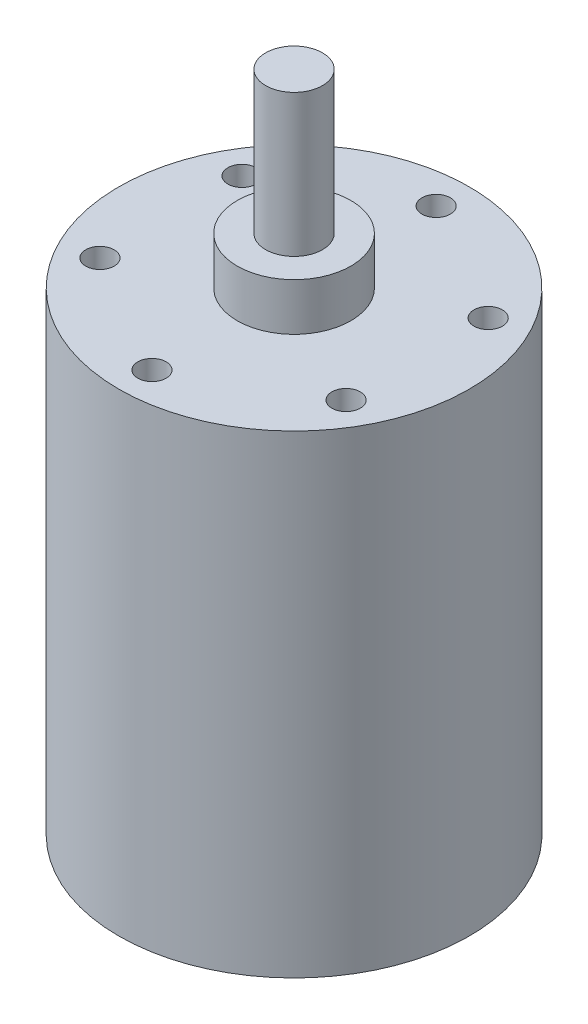
ISO-10303-21;
HEADER;
FILE_DESCRIPTION(('STEP AP214'),'2;1');
FILE_NAME('part.step','',(''),(''),'','','');
FILE_SCHEMA(('AUTOMOTIVE_DESIGN { 1 0 10303 214 1 1 1 1 }'));
ENDSEC;
DATA;
#1=APPLICATION_CONTEXT('core data for automotive mechanical design processes');
#2=APPLICATION_PROTOCOL_DEFINITION('international standard','automotive_design',2000,#1);
#3=PRODUCT_CONTEXT('',#1,'mechanical');
#4=PRODUCT('Part','Part','',(#3));
#5=PRODUCT_RELATED_PRODUCT_CATEGORY('part','',(#4));
#6=PRODUCT_DEFINITION_FORMATION('','',#4);
#7=PRODUCT_DEFINITION_CONTEXT('part definition',#1,'design');
#8=PRODUCT_DEFINITION('design','',#6,#7);
#9=PRODUCT_DEFINITION_SHAPE('','',#8);
#10=(LENGTH_UNIT() NAMED_UNIT(*) SI_UNIT(.MILLI.,.METRE.));
#11=(NAMED_UNIT(*) PLANE_ANGLE_UNIT() SI_UNIT($,.RADIAN.));
#12=(NAMED_UNIT(*) SI_UNIT($,.STERADIAN.) SOLID_ANGLE_UNIT());
#13=UNCERTAINTY_MEASURE_WITH_UNIT(LENGTH_MEASURE(1.E-05),#10,'distance_accuracy_value','');
#14=(GEOMETRIC_REPRESENTATION_CONTEXT(3) GLOBAL_UNCERTAINTY_ASSIGNED_CONTEXT((#13)) GLOBAL_UNIT_ASSIGNED_CONTEXT((#10,
#11,#12)) REPRESENTATION_CONTEXT('',''));
#15=CARTESIAN_POINT('',(0.,0.,0.));
#16=DIRECTION('',(0.,0.,1.));
#17=DIRECTION('',(1.,0.,0.));
#18=AXIS2_PLACEMENT_3D('',#15,#16,#17);
#19=CARTESIAN_POINT('',(0.,50.,0.));
#20=DIRECTION('',(0.,-1.,0.));
#21=DIRECTION('',(0.,0.,-1.));
#22=AXIS2_PLACEMENT_3D('',#19,#20,#21);
#23=CYLINDRICAL_SURFACE('',#22,18.5);
#24=CARTESIAN_POINT('',(0.,50.,0.));
#25=DIRECTION('',(0.,1.,0.));
#26=DIRECTION('',(0.,0.,1.));
#27=AXIS2_PLACEMENT_3D('',#24,#25,#26);
#28=CIRCLE('',#27,18.5);
#29=CARTESIAN_POINT('',(0.,50.,18.5));
#30=VERTEX_POINT('',#29);
#31=EDGE_CURVE('E42',#30,#30,#28,.T.);
#32=ORIENTED_EDGE('',*,*,#31,.F.);
#33=EDGE_LOOP('',(#32));
#34=FACE_BOUND('',#33,.T.);
#35=CARTESIAN_POINT('',(0.,0.,0.));
#36=DIRECTION('',(0.,1.,0.));
#37=DIRECTION('',(0.,0.,1.));
#38=AXIS2_PLACEMENT_3D('',#35,#36,#37);
#39=CIRCLE('',#38,18.5);
#40=CARTESIAN_POINT('',(0.,0.,18.5));
#41=VERTEX_POINT('',#40);
#42=EDGE_CURVE('E33',#41,#41,#39,.T.);
#43=ORIENTED_EDGE('',*,*,#42,.T.);
#44=EDGE_LOOP('',(#43));
#45=FACE_BOUND('',#44,.T.);
#46=ADVANCED_FACE('F30',(#34,#45),#23,.T.);
#47=CARTESIAN_POINT('',(0.,50.,0.));
#48=DIRECTION('',(0.,1.,0.));
#49=DIRECTION('',(0.,0.,1.));
#50=AXIS2_PLACEMENT_3D('',#47,#48,#49);
#51=PLANE('',#50);
#52=CARTESIAN_POINT('',(0.,50.,-15.));
#53=DIRECTION('',(0.,1.,0.));
#54=DIRECTION('',(0.,0.,1.));
#55=AXIS2_PLACEMENT_3D('',#52,#53,#54);
#56=CIRCLE('',#55,1.5);
#57=CARTESIAN_POINT('',(0.,50.,-13.5));
#58=VERTEX_POINT('',#57);
#59=EDGE_CURVE('E250',#58,#58,#56,.T.);
#60=ORIENTED_EDGE('',*,*,#59,.F.);
#61=EDGE_LOOP('',(#60));
#62=FACE_BOUND('',#61,.T.);
#63=CARTESIAN_POINT('',(-12.9903810567666,50.,-7.49999999999999));
#64=DIRECTION('',(0.,1.,0.));
#65=DIRECTION('',(0.,0.,1.));
#66=AXIS2_PLACEMENT_3D('',#63,#64,#65);
#67=CIRCLE('',#66,1.5);
#68=CARTESIAN_POINT('',(-12.9903810567666,50.,-5.99999999999999));
#69=VERTEX_POINT('',#68);
#70=EDGE_CURVE('E261',#69,#69,#67,.T.);
#71=ORIENTED_EDGE('',*,*,#70,.F.);
#72=EDGE_LOOP('',(#71));
#73=FACE_BOUND('',#72,.T.);
#74=CARTESIAN_POINT('',(-12.9903810567666,50.,7.50000000000001));
#75=DIRECTION('',(0.,1.,0.));
#76=DIRECTION('',(0.,0.,1.));
#77=AXIS2_PLACEMENT_3D('',#74,#75,#76);
#78=CIRCLE('',#77,1.5);
#79=CARTESIAN_POINT('',(-12.9903810567666,50.,9.));
#80=VERTEX_POINT('',#79);
#81=EDGE_CURVE('E260',#80,#80,#78,.T.);
#82=ORIENTED_EDGE('',*,*,#81,.F.);
#83=EDGE_LOOP('',(#82));
#84=FACE_BOUND('',#83,.T.);
#85=CARTESIAN_POINT('',(0.,50.,15.));
#86=DIRECTION('',(0.,1.,0.));
#87=DIRECTION('',(0.,0.,1.));
#88=AXIS2_PLACEMENT_3D('',#85,#86,#87);
#89=CIRCLE('',#88,1.5);
#90=CARTESIAN_POINT('',(0.,50.,16.5));
#91=VERTEX_POINT('',#90);
#92=EDGE_CURVE('E278',#91,#91,#89,.T.);
#93=ORIENTED_EDGE('',*,*,#92,.F.);
#94=EDGE_LOOP('',(#93));
#95=FACE_BOUND('',#94,.T.);
#96=CARTESIAN_POINT('',(12.9903810567666,50.,7.5));
#97=DIRECTION('',(0.,1.,0.));
#98=DIRECTION('',(0.,0.,1.));
#99=AXIS2_PLACEMENT_3D('',#96,#97,#98);
#100=CIRCLE('',#99,1.5);
#101=CARTESIAN_POINT('',(12.9903810567666,50.,9.));
#102=VERTEX_POINT('',#101);
#103=EDGE_CURVE('E272',#102,#102,#100,.T.);
#104=ORIENTED_EDGE('',*,*,#103,.F.);
#105=EDGE_LOOP('',(#104));
#106=FACE_BOUND('',#105,.T.);
#107=CARTESIAN_POINT('',(12.9903810567666,50.,-7.5));
#108=DIRECTION('',(0.,1.,0.));
#109=DIRECTION('',(0.,0.,1.));
#110=AXIS2_PLACEMENT_3D('',#107,#108,#109);
#111=CIRCLE('',#110,1.5);
#112=CARTESIAN_POINT('',(12.9903810567666,50.,-6.00000000000001));
#113=VERTEX_POINT('',#112);
#114=EDGE_CURVE('E266',#113,#113,#111,.T.);
#115=ORIENTED_EDGE('',*,*,#114,.F.);
#116=EDGE_LOOP('',(#115));
#117=FACE_BOUND('',#116,.T.);
#118=CARTESIAN_POINT('',(0.,50.,0.));
#119=DIRECTION('',(0.,1.,0.));
#120=DIRECTION('',(0.,0.,1.));
#121=AXIS2_PLACEMENT_3D('',#118,#119,#120);
#122=CIRCLE('',#121,6.);
#123=CARTESIAN_POINT('',(0.,50.,6.));
#124=VERTEX_POINT('',#123);
#125=EDGE_CURVE('E37',#124,#124,#122,.T.);
#126=ORIENTED_EDGE('',*,*,#125,.F.);
#127=EDGE_LOOP('',(#126));
#128=FACE_BOUND('',#127,.T.);
#129=ORIENTED_EDGE('',*,*,#31,.T.);
#130=EDGE_LOOP('',(#129));
#131=FACE_BOUND('',#130,.T.);
#132=ADVANCED_FACE('F60',(#62,#73,#84,#95,#106,#117,#128,#131),#51,.T.);
#133=CARTESIAN_POINT('',(0.,0.,0.));
#134=DIRECTION('',(0.,1.,0.));
#135=DIRECTION('',(0.,0.,1.));
#136=AXIS2_PLACEMENT_3D('',#133,#134,#135);
#137=PLANE('',#136);
#138=ORIENTED_EDGE('',*,*,#42,.F.);
#139=EDGE_LOOP('',(#138));
#140=FACE_BOUND('',#139,.T.);
#141=ADVANCED_FACE('F57',(#140),#137,.F.);
#142=CARTESIAN_POINT('',(0.,55.,0.));
#143=DIRECTION('',(0.,-1.,0.));
#144=DIRECTION('',(0.,0.,-1.));
#145=AXIS2_PLACEMENT_3D('',#142,#143,#144);
#146=CYLINDRICAL_SURFACE('',#145,6.);
#147=CARTESIAN_POINT('',(0.,55.,0.));
#148=DIRECTION('',(0.,1.,0.));
#149=DIRECTION('',(0.,0.,1.));
#150=AXIS2_PLACEMENT_3D('',#147,#148,#149);
#151=CIRCLE('',#150,6.);
#152=CARTESIAN_POINT('',(0.,55.,6.));
#153=VERTEX_POINT('',#152);
#154=EDGE_CURVE('E48',#153,#153,#151,.T.);
#155=ORIENTED_EDGE('',*,*,#154,.F.);
#156=EDGE_LOOP('',(#155));
#157=FACE_BOUND('',#156,.T.);
#158=ORIENTED_EDGE('',*,*,#125,.T.);
#159=EDGE_LOOP('',(#158));
#160=FACE_BOUND('',#159,.T.);
#161=ADVANCED_FACE('F59',(#157,#160),#146,.T.);
#162=CARTESIAN_POINT('',(0.,55.,0.));
#163=DIRECTION('',(0.,1.,0.));
#164=DIRECTION('',(0.,0.,1.));
#165=AXIS2_PLACEMENT_3D('',#162,#163,#164);
#166=PLANE('',#165);
#167=CARTESIAN_POINT('',(0.,55.,0.));
#168=DIRECTION('',(0.,1.,0.));
#169=DIRECTION('',(0.,0.,1.));
#170=AXIS2_PLACEMENT_3D('',#167,#168,#169);
#171=CIRCLE('',#170,3.);
#172=CARTESIAN_POINT('',(0.,55.,3.));
#173=VERTEX_POINT('',#172);
#174=EDGE_CURVE('E10',#173,#173,#171,.T.);
#175=ORIENTED_EDGE('',*,*,#174,.F.);
#176=EDGE_LOOP('',(#175));
#177=FACE_BOUND('',#176,.T.);
#178=ORIENTED_EDGE('',*,*,#154,.T.);
#179=EDGE_LOOP('',(#178));
#180=FACE_BOUND('',#179,.T.);
#181=ADVANCED_FACE('F65',(#177,#180),#166,.T.);
#182=CARTESIAN_POINT('',(0.,70.,0.));
#183=DIRECTION('',(0.,-1.,0.));
#184=DIRECTION('',(0.,0.,-1.));
#185=AXIS2_PLACEMENT_3D('',#182,#183,#184);
#186=CYLINDRICAL_SURFACE('',#185,3.);
#187=CARTESIAN_POINT('',(0.,70.,0.));
#188=DIRECTION('',(0.,1.,0.));
#189=DIRECTION('',(0.,0.,1.));
#190=AXIS2_PLACEMENT_3D('',#187,#188,#189);
#191=CIRCLE('',#190,3.);
#192=CARTESIAN_POINT('',(0.,70.,3.));
#193=VERTEX_POINT('',#192);
#194=EDGE_CURVE('E46',#193,#193,#191,.T.);
#195=ORIENTED_EDGE('',*,*,#194,.F.);
#196=EDGE_LOOP('',(#195));
#197=FACE_BOUND('',#196,.T.);
#198=ORIENTED_EDGE('',*,*,#174,.T.);
#199=EDGE_LOOP('',(#198));
#200=FACE_BOUND('',#199,.T.);
#201=ADVANCED_FACE('F212',(#197,#200),#186,.T.);
#202=CARTESIAN_POINT('',(0.,70.,0.));
#203=DIRECTION('',(0.,1.,0.));
#204=DIRECTION('',(0.,0.,1.));
#205=AXIS2_PLACEMENT_3D('',#202,#203,#204);
#206=PLANE('',#205);
#207=ORIENTED_EDGE('',*,*,#194,.T.);
#208=EDGE_LOOP('',(#207));
#209=FACE_BOUND('',#208,.T.);
#210=ADVANCED_FACE('F85',(#209),#206,.T.);
#211=CARTESIAN_POINT('',(12.9903810567666,40.,-7.5));
#212=DIRECTION('',(0.,1.,0.));
#213=DIRECTION('',(0.,0.,1.));
#214=AXIS2_PLACEMENT_3D('',#211,#212,#213);
#215=CYLINDRICAL_SURFACE('',#214,1.5);
#216=CARTESIAN_POINT('',(12.9903810567666,40.,-7.5));
#217=DIRECTION('',(0.,1.,0.));
#218=DIRECTION('',(0.,0.,1.));
#219=AXIS2_PLACEMENT_3D('',#216,#217,#218);
#220=CIRCLE('',#219,1.5);
#221=CARTESIAN_POINT('',(12.9903810567666,40.,-6.00000000000001));
#222=VERTEX_POINT('',#221);
#223=EDGE_CURVE('E254',#222,#222,#220,.T.);
#224=ORIENTED_EDGE('',*,*,#223,.F.);
#225=EDGE_LOOP('',(#224));
#226=FACE_BOUND('',#225,.T.);
#227=ORIENTED_EDGE('',*,*,#114,.T.);
#228=EDGE_LOOP('',(#227));
#229=FACE_BOUND('',#228,.T.);
#230=ADVANCED_FACE('F90',(#226,#229),#215,.F.);
#231=CARTESIAN_POINT('',(12.9903810567666,40.,-7.5));
#232=DIRECTION('',(0.,1.,0.));
#233=DIRECTION('',(0.,0.,1.));
#234=AXIS2_PLACEMENT_3D('',#231,#232,#233);
#235=PLANE('',#234);
#236=ORIENTED_EDGE('',*,*,#223,.T.);
#237=EDGE_LOOP('',(#236));
#238=FACE_BOUND('',#237,.T.);
#239=ADVANCED_FACE('F95',(#238),#235,.T.);
#240=CARTESIAN_POINT('',(12.9903810567666,40.,7.5));
#241=DIRECTION('',(0.,1.,0.));
#242=DIRECTION('',(0.,0.,1.));
#243=AXIS2_PLACEMENT_3D('',#240,#241,#242);
#244=CYLINDRICAL_SURFACE('',#243,1.5);
#245=CARTESIAN_POINT('',(12.9903810567666,40.,7.5));
#246=DIRECTION('',(0.,1.,0.));
#247=DIRECTION('',(0.,0.,1.));
#248=AXIS2_PLACEMENT_3D('',#245,#246,#247);
#249=CIRCLE('',#248,1.5);
#250=CARTESIAN_POINT('',(12.9903810567666,40.,9.));
#251=VERTEX_POINT('',#250);
#252=EDGE_CURVE('E269',#251,#251,#249,.T.);
#253=ORIENTED_EDGE('',*,*,#252,.F.);
#254=EDGE_LOOP('',(#253));
#255=FACE_BOUND('',#254,.T.);
#256=ORIENTED_EDGE('',*,*,#103,.T.);
#257=EDGE_LOOP('',(#256));
#258=FACE_BOUND('',#257,.T.);
#259=ADVANCED_FACE('F105',(#255,#258),#244,.F.);
#260=CARTESIAN_POINT('',(12.9903810567666,40.,7.5));
#261=DIRECTION('',(0.,1.,0.));
#262=DIRECTION('',(0.,0.,1.));
#263=AXIS2_PLACEMENT_3D('',#260,#261,#262);
#264=PLANE('',#263);
#265=ORIENTED_EDGE('',*,*,#252,.T.);
#266=EDGE_LOOP('',(#265));
#267=FACE_BOUND('',#266,.T.);
#268=ADVANCED_FACE('F115',(#267),#264,.T.);
#269=CARTESIAN_POINT('',(0.,40.,15.));
#270=DIRECTION('',(0.,1.,0.));
#271=DIRECTION('',(0.,0.,1.));
#272=AXIS2_PLACEMENT_3D('',#269,#270,#271);
#273=CYLINDRICAL_SURFACE('',#272,1.5);
#274=CARTESIAN_POINT('',(0.,40.,15.));
#275=DIRECTION('',(0.,1.,0.));
#276=DIRECTION('',(0.,0.,1.));
#277=AXIS2_PLACEMENT_3D('',#274,#275,#276);
#278=CIRCLE('',#277,1.5);
#279=CARTESIAN_POINT('',(0.,40.,16.5));
#280=VERTEX_POINT('',#279);
#281=EDGE_CURVE('E275',#280,#280,#278,.T.);
#282=ORIENTED_EDGE('',*,*,#281,.F.);
#283=EDGE_LOOP('',(#282));
#284=FACE_BOUND('',#283,.T.);
#285=ORIENTED_EDGE('',*,*,#92,.T.);
#286=EDGE_LOOP('',(#285));
#287=FACE_BOUND('',#286,.T.);
#288=ADVANCED_FACE('F125',(#284,#287),#273,.F.);
#289=CARTESIAN_POINT('',(0.,40.,15.));
#290=DIRECTION('',(0.,1.,0.));
#291=DIRECTION('',(0.,0.,1.));
#292=AXIS2_PLACEMENT_3D('',#289,#290,#291);
#293=PLANE('',#292);
#294=ORIENTED_EDGE('',*,*,#281,.T.);
#295=EDGE_LOOP('',(#294));
#296=FACE_BOUND('',#295,.T.);
#297=ADVANCED_FACE('F135',(#296),#293,.T.);
#298=CARTESIAN_POINT('',(-12.9903810567666,40.,7.50000000000001));
#299=DIRECTION('',(0.,1.,0.));
#300=DIRECTION('',(0.,0.,1.));
#301=AXIS2_PLACEMENT_3D('',#298,#299,#300);
#302=CYLINDRICAL_SURFACE('',#301,1.5);
#303=CARTESIAN_POINT('',(-12.9903810567666,40.,7.50000000000001));
#304=DIRECTION('',(0.,1.,0.));
#305=DIRECTION('',(0.,0.,1.));
#306=AXIS2_PLACEMENT_3D('',#303,#304,#305);
#307=CIRCLE('',#306,1.5);
#308=CARTESIAN_POINT('',(-12.9903810567666,40.,9.));
#309=VERTEX_POINT('',#308);
#310=EDGE_CURVE('E281',#309,#309,#307,.T.);
#311=ORIENTED_EDGE('',*,*,#310,.F.);
#312=EDGE_LOOP('',(#311));
#313=FACE_BOUND('',#312,.T.);
#314=ORIENTED_EDGE('',*,*,#81,.T.);
#315=EDGE_LOOP('',(#314));
#316=FACE_BOUND('',#315,.T.);
#317=ADVANCED_FACE('F145',(#313,#316),#302,.F.);
#318=CARTESIAN_POINT('',(-12.9903810567666,40.,7.50000000000001));
#319=DIRECTION('',(0.,1.,0.));
#320=DIRECTION('',(0.,0.,1.));
#321=AXIS2_PLACEMENT_3D('',#318,#319,#320);
#322=PLANE('',#321);
#323=ORIENTED_EDGE('',*,*,#310,.T.);
#324=EDGE_LOOP('',(#323));
#325=FACE_BOUND('',#324,.T.);
#326=ADVANCED_FACE('F155',(#325),#322,.T.);
#327=CARTESIAN_POINT('',(-12.9903810567666,40.,-7.49999999999999));
#328=DIRECTION('',(0.,1.,0.));
#329=DIRECTION('',(0.,0.,1.));
#330=AXIS2_PLACEMENT_3D('',#327,#328,#329);
#331=CYLINDRICAL_SURFACE('',#330,1.5);
#332=CARTESIAN_POINT('',(-12.9903810567666,40.,-7.49999999999999));
#333=DIRECTION('',(0.,1.,0.));
#334=DIRECTION('',(0.,0.,1.));
#335=AXIS2_PLACEMENT_3D('',#332,#333,#334);
#336=CIRCLE('',#335,1.5);
#337=CARTESIAN_POINT('',(-12.9903810567666,40.,-5.99999999999999));
#338=VERTEX_POINT('',#337);
#339=EDGE_CURVE('E257',#338,#338,#336,.T.);
#340=ORIENTED_EDGE('',*,*,#339,.F.);
#341=EDGE_LOOP('',(#340));
#342=FACE_BOUND('',#341,.T.);
#343=ORIENTED_EDGE('',*,*,#70,.T.);
#344=EDGE_LOOP('',(#343));
#345=FACE_BOUND('',#344,.T.);
#346=ADVANCED_FACE('F165',(#342,#345),#331,.F.);
#347=CARTESIAN_POINT('',(-12.9903810567666,40.,-7.49999999999999));
#348=DIRECTION('',(0.,1.,0.));
#349=DIRECTION('',(0.,0.,1.));
#350=AXIS2_PLACEMENT_3D('',#347,#348,#349);
#351=PLANE('',#350);
#352=ORIENTED_EDGE('',*,*,#339,.T.);
#353=EDGE_LOOP('',(#352));
#354=FACE_BOUND('',#353,.T.);
#355=ADVANCED_FACE('F175',(#354),#351,.T.);
#356=CARTESIAN_POINT('',(0.,40.,-15.));
#357=DIRECTION('',(0.,1.,0.));
#358=DIRECTION('',(0.,0.,1.));
#359=AXIS2_PLACEMENT_3D('',#356,#357,#358);
#360=CYLINDRICAL_SURFACE('',#359,1.5);
#361=CARTESIAN_POINT('',(0.,40.,-15.));
#362=DIRECTION('',(0.,1.,0.));
#363=DIRECTION('',(0.,0.,1.));
#364=AXIS2_PLACEMENT_3D('',#361,#362,#363);
#365=CIRCLE('',#364,1.5);
#366=CARTESIAN_POINT('',(0.,40.,-13.5));
#367=VERTEX_POINT('',#366);
#368=EDGE_CURVE('E249',#367,#367,#365,.T.);
#369=ORIENTED_EDGE('',*,*,#368,.F.);
#370=EDGE_LOOP('',(#369));
#371=FACE_BOUND('',#370,.T.);
#372=ORIENTED_EDGE('',*,*,#59,.T.);
#373=EDGE_LOOP('',(#372));
#374=FACE_BOUND('',#373,.T.);
#375=ADVANCED_FACE('F185',(#371,#374),#360,.F.);
#376=CARTESIAN_POINT('',(0.,40.,-15.));
#377=DIRECTION('',(0.,1.,0.));
#378=DIRECTION('',(0.,0.,1.));
#379=AXIS2_PLACEMENT_3D('',#376,#377,#378);
#380=PLANE('',#379);
#381=ORIENTED_EDGE('',*,*,#368,.T.);
#382=EDGE_LOOP('',(#381));
#383=FACE_BOUND('',#382,.T.);
#384=ADVANCED_FACE('F195',(#383),#380,.T.);
#385=CLOSED_SHELL('',(#46,#132,#141,#161,#181,#201,#210,#230,#239,#259,#268,#288,#297,#317,#326,
#346,#355,#375,#384));
#386=MANIFOLD_SOLID_BREP('B2',#385);
#387=ADVANCED_BREP_SHAPE_REPRESENTATION('',(#18,#386),#14);
#388=SHAPE_DEFINITION_REPRESENTATION(#9,#387);
ENDSEC;
END-ISO-10303-21;
